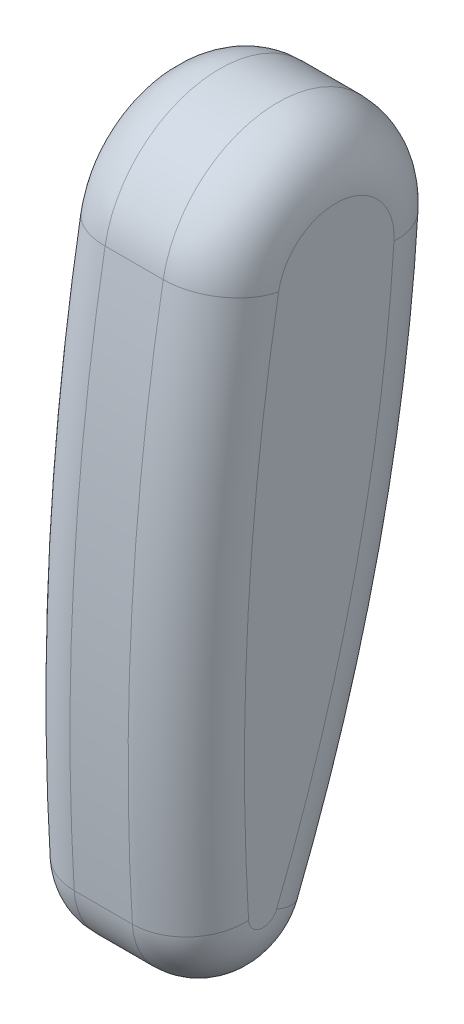
ISO-10303-21;
HEADER;
FILE_DESCRIPTION(('STEP AP214'),'2;1');
FILE_NAME('part.step','',(''),(''),'','','');
FILE_SCHEMA(('AUTOMOTIVE_DESIGN { 1 0 10303 214 1 1 1 1 }'));
ENDSEC;
DATA;
#1=APPLICATION_CONTEXT('core data for automotive mechanical design processes');
#2=APPLICATION_PROTOCOL_DEFINITION('international standard','automotive_design',2000,#1);
#3=PRODUCT_CONTEXT('',#1,'mechanical');
#4=PRODUCT('Part','Part','',(#3));
#5=PRODUCT_RELATED_PRODUCT_CATEGORY('part','',(#4));
#6=PRODUCT_DEFINITION_FORMATION('','',#4);
#7=PRODUCT_DEFINITION_CONTEXT('part definition',#1,'design');
#8=PRODUCT_DEFINITION('design','',#6,#7);
#9=PRODUCT_DEFINITION_SHAPE('','',#8);
#10=(LENGTH_UNIT() NAMED_UNIT(*) SI_UNIT(.MILLI.,.METRE.));
#11=(NAMED_UNIT(*) PLANE_ANGLE_UNIT() SI_UNIT($,.RADIAN.));
#12=(NAMED_UNIT(*) SI_UNIT($,.STERADIAN.) SOLID_ANGLE_UNIT());
#13=UNCERTAINTY_MEASURE_WITH_UNIT(LENGTH_MEASURE(1.E-05),#10,'distance_accuracy_value','');
#14=(GEOMETRIC_REPRESENTATION_CONTEXT(3) GLOBAL_UNCERTAINTY_ASSIGNED_CONTEXT((#13)) GLOBAL_UNIT_ASSIGNED_CONTEXT((#10,
#11,#12)) REPRESENTATION_CONTEXT('',''));
#15=CARTESIAN_POINT('',(0.,0.,0.));
#16=DIRECTION('',(0.,0.,1.));
#17=DIRECTION('',(1.,0.,0.));
#18=AXIS2_PLACEMENT_3D('',#15,#16,#17);
#19=CARTESIAN_POINT('',(190.5,-636.965855606091,-1940.75192617247));
#20=DIRECTION('',(-1.,0.,0.));
#21=DIRECTION('',(0.,0.,1.));
#22=AXIS2_PLACEMENT_3D('',#19,#20,#21);
#23=CYLINDRICAL_SURFACE('',#22,2032.);
#24=DIRECTION('',(-1.,0.,0.));
#25=VECTOR('',#24,1.);
#26=CARTESIAN_POINT('',(190.5,-285.382596894668,60.6009193282553));
#27=LINE('',#26,#25);
#28=CARTESIAN_POINT('',(139.7,-285.382596894668,60.6009193282553));
#29=VERTEX_POINT('',#28);
#30=CARTESIAN_POINT('',(88.9000000000001,-285.382596894668,60.6009193282553));
#31=VERTEX_POINT('',#30);
#32=EDGE_CURVE('E140',#29,#31,#27,.T.);
#33=ORIENTED_EDGE('',*,*,#32,.T.);
#34=CARTESIAN_POINT('',(88.9000000000001,-636.965855606091,-1940.75192617247));
#35=DIRECTION('',(-1.,0.,0.));
#36=DIRECTION('',(0.,0.,1.));
#37=AXIS2_PLACEMENT_3D('',#34,#35,#36);
#38=CIRCLE('',#37,2032.);
#39=CARTESIAN_POINT('',(88.9000000000001,-759.542851996072,87.547578327791));
#40=VERTEX_POINT('',#39);
#41=EDGE_CURVE('E161',#31,#40,#38,.F.);
#42=ORIENTED_EDGE('',*,*,#41,.T.);
#43=DIRECTION('',(-1.,0.,0.));
#44=VECTOR('',#43,1.);
#45=CARTESIAN_POINT('',(190.5,-759.542851996072,87.547578327791));
#46=LINE('',#45,#44);
#47=CARTESIAN_POINT('',(139.7,-759.542851996072,87.547578327791));
#48=VERTEX_POINT('',#47);
#49=EDGE_CURVE('E114',#48,#40,#46,.T.);
#50=ORIENTED_EDGE('',*,*,#49,.F.);
#51=CARTESIAN_POINT('',(139.7,-636.965855606091,-1940.75192617247));
#52=DIRECTION('',(-1.,0.,0.));
#53=DIRECTION('',(0.,0.,1.));
#54=AXIS2_PLACEMENT_3D('',#51,#52,#53);
#55=CIRCLE('',#54,2032.);
#56=EDGE_CURVE('E159',#48,#29,#55,.T.);
#57=ORIENTED_EDGE('',*,*,#56,.T.);
#58=EDGE_LOOP('',(#33,#42,#50,#57));
#59=FACE_BOUND('',#58,.T.);
#60=ADVANCED_FACE('F30',(#59),#23,.T.);
#61=CARTESIAN_POINT('',(190.5,-755.712320858886,24.1632188121575));
#62=DIRECTION('',(-1.,0.,0.));
#63=DIRECTION('',(0.,0.,1.));
#64=AXIS2_PLACEMENT_3D('',#61,#62,#63);
#65=CYLINDRICAL_SURFACE('',#64,63.5000000000002);
#66=ORIENTED_EDGE('',*,*,#49,.T.);
#67=CARTESIAN_POINT('',(88.9000000000001,-755.712320858886,24.1632188121575));
#68=DIRECTION('',(-1.,0.,0.));
#69=DIRECTION('',(0.,0.,1.));
#70=AXIS2_PLACEMENT_3D('',#67,#68,#69);
#71=CIRCLE('',#70,63.5000000000002);
#72=CARTESIAN_POINT('',(88.9000000000001,-779.308424571083,-34.7899311427283));
#73=VERTEX_POINT('',#72);
#74=EDGE_CURVE('E113',#40,#73,#71,.F.);
#75=ORIENTED_EDGE('',*,*,#74,.T.);
#76=DIRECTION('',(-1.,0.,0.));
#77=VECTOR('',#76,1.);
#78=CARTESIAN_POINT('',(190.5,-779.308424571083,-34.7899311427283));
#79=LINE('',#78,#77);
#80=CARTESIAN_POINT('',(139.7,-779.308424571083,-34.7899311427283));
#81=VERTEX_POINT('',#80);
#82=EDGE_CURVE('E96',#81,#73,#79,.T.);
#83=ORIENTED_EDGE('',*,*,#82,.F.);
#84=CARTESIAN_POINT('',(139.7,-755.712320858886,24.1632188121575));
#85=DIRECTION('',(-1.,0.,0.));
#86=DIRECTION('',(0.,0.,1.));
#87=AXIS2_PLACEMENT_3D('',#84,#85,#86);
#88=CIRCLE('',#87,63.5000000000002);
#89=EDGE_CURVE('E110',#81,#48,#88,.T.);
#90=ORIENTED_EDGE('',*,*,#89,.T.);
#91=EDGE_LOOP('',(#66,#75,#83,#90));
#92=FACE_BOUND('',#91,.T.);
#93=ADVANCED_FACE('F109',(#92),#65,.T.);
#94=CARTESIAN_POINT('',(190.5,-213.001935478344,1380.08566777453));
#95=DIRECTION('',(-1.,0.,0.));
#96=DIRECTION('',(0.,0.,1.));
#97=AXIS2_PLACEMENT_3D('',#94,#95,#96);
#98=CYLINDRICAL_SURFACE('',#97,1524.);
#99=ORIENTED_EDGE('',*,*,#82,.T.);
#100=CARTESIAN_POINT('',(88.9000000000001,-213.001935478344,1380.08566777453));
#101=DIRECTION('',(-1.,0.,0.));
#102=DIRECTION('',(0.,0.,1.));
#103=AXIS2_PLACEMENT_3D('',#100,#101,#102);
#104=CIRCLE('',#103,1524.);
#105=CARTESIAN_POINT('',(88.9000000000001,-309.38746156966,-140.863322284017));
#106=VERTEX_POINT('',#105);
#107=EDGE_CURVE('E102',#73,#106,#104,.F.);
#108=ORIENTED_EDGE('',*,*,#107,.T.);
#109=DIRECTION('',(-1.,0.,0.));
#110=VECTOR('',#109,1.);
#111=CARTESIAN_POINT('',(190.5,-309.38746156966,-140.863322284017));
#112=LINE('',#111,#110);
#113=CARTESIAN_POINT('',(139.7,-309.38746156966,-140.863322284017));
#114=VERTEX_POINT('',#113);
#115=EDGE_CURVE('E98',#114,#106,#112,.T.);
#116=ORIENTED_EDGE('',*,*,#115,.F.);
#117=CARTESIAN_POINT('',(139.7,-213.001935478344,1380.08566777453));
#118=DIRECTION('',(-1.,0.,0.));
#119=DIRECTION('',(0.,0.,1.));
#120=AXIS2_PLACEMENT_3D('',#117,#118,#119);
#121=CIRCLE('',#120,1524.);
#122=EDGE_CURVE('E93',#114,#81,#121,.T.);
#123=ORIENTED_EDGE('',*,*,#122,.T.);
#124=EDGE_LOOP('',(#99,#108,#116,#123));
#125=FACE_BOUND('',#124,.T.);
#126=ADVANCED_FACE('F95',(#125),#98,.T.);
#127=CARTESIAN_POINT('',(190.5,-302.961759830239,-39.4667229467812));
#128=DIRECTION('',(-1.,0.,0.));
#129=DIRECTION('',(0.,0.,1.));
#130=AXIS2_PLACEMENT_3D('',#127,#128,#129);
#131=CYLINDRICAL_SURFACE('',#130,101.6);
#132=ORIENTED_EDGE('',*,*,#115,.T.);
#133=CARTESIAN_POINT('',(88.9000000000001,-302.961759830239,-39.4667229467812));
#134=DIRECTION('',(-1.,0.,0.));
#135=DIRECTION('',(0.,0.,1.));
#136=AXIS2_PLACEMENT_3D('',#133,#134,#135);
#137=CIRCLE('',#136,101.6);
#138=EDGE_CURVE('E157',#106,#31,#137,.F.);
#139=ORIENTED_EDGE('',*,*,#138,.T.);
#140=ORIENTED_EDGE('',*,*,#32,.F.);
#141=CARTESIAN_POINT('',(139.7,-302.961759830239,-39.4667229467812));
#142=DIRECTION('',(-1.,0.,0.));
#143=DIRECTION('',(0.,0.,1.));
#144=AXIS2_PLACEMENT_3D('',#141,#142,#143);
#145=CIRCLE('',#144,101.6);
#146=EDGE_CURVE('E155',#29,#114,#145,.T.);
#147=ORIENTED_EDGE('',*,*,#146,.T.);
#148=EDGE_LOOP('',(#132,#139,#140,#147));
#149=FACE_BOUND('',#148,.T.);
#150=ADVANCED_FACE('F177',(#149),#131,.T.);
#151=CARTESIAN_POINT('',(190.5,-469.963807718165,-990.109324559626));
#152=DIRECTION('',(-1.,0.,0.));
#153=DIRECTION('',(0.,0.,1.));
#154=AXIS2_PLACEMENT_3D('',#151,#152,#153);
#155=PLANE('',#154);
#156=CARTESIAN_POINT('',(190.5,-213.001935478344,1380.08566777453));
#157=DIRECTION('',(-1.,0.,0.));
#158=DIRECTION('',(0.,0.,1.));
#159=AXIS2_PLACEMENT_3D('',#156,#157,#158);
#160=CIRCLE('',#159,1473.2);
#161=CARTESIAN_POINT('',(190.5,-760.431541601325,12.3725888211802));
#162=VERTEX_POINT('',#161);
#163=CARTESIAN_POINT('',(190.5,-306.174610699949,-90.1650226153994));
#164=VERTEX_POINT('',#163);
#165=EDGE_CURVE('E37',#162,#164,#160,.F.);
#166=ORIENTED_EDGE('',*,*,#165,.T.);
#167=CARTESIAN_POINT('',(190.5,-302.961759830239,-39.4667229467812));
#168=DIRECTION('',(-1.,0.,0.));
#169=DIRECTION('',(0.,0.,1.));
#170=AXIS2_PLACEMENT_3D('',#167,#168,#169);
#171=CIRCLE('',#170,50.8000000000002);
#172=CARTESIAN_POINT('',(190.5,-294.172178362453,10.5670981907374));
#173=VERTEX_POINT('',#172);
#174=EDGE_CURVE('E11',#164,#173,#171,.F.);
#175=ORIENTED_EDGE('',*,*,#174,.T.);
#176=CARTESIAN_POINT('',(190.5,-636.965855606091,-1940.75192617247));
#177=DIRECTION('',(-1.,0.,0.));
#178=DIRECTION('',(0.,0.,1.));
#179=AXIS2_PLACEMENT_3D('',#176,#177,#178);
#180=CIRCLE('',#179,1981.2);
#181=CARTESIAN_POINT('',(190.5,-756.478427086323,36.8400907152844));
#182=VERTEX_POINT('',#181);
#183=EDGE_CURVE('E163',#173,#182,#180,.F.);
#184=ORIENTED_EDGE('',*,*,#183,.T.);
#185=CARTESIAN_POINT('',(190.5,-755.712320858886,24.1632188121575));
#186=DIRECTION('',(-1.,0.,0.));
#187=DIRECTION('',(0.,0.,1.));
#188=AXIS2_PLACEMENT_3D('',#185,#186,#187);
#189=CIRCLE('',#188,12.7000000000002);
#190=EDGE_CURVE('E47',#182,#162,#189,.F.);
#191=ORIENTED_EDGE('',*,*,#190,.T.);
#192=EDGE_LOOP('',(#166,#175,#184,#191));
#193=FACE_BOUND('',#192,.T.);
#194=ADVANCED_FACE('F166',(#193),#155,.F.);
#195=CARTESIAN_POINT('',(38.1000000000001,-469.963807718165,-990.109324559626));
#196=DIRECTION('',(-1.,0.,0.));
#197=DIRECTION('',(0.,0.,1.));
#198=AXIS2_PLACEMENT_3D('',#195,#196,#197);
#199=PLANE('',#198);
#200=CARTESIAN_POINT('',(38.1000000000001,-213.001935478344,1380.08566777453));
#201=DIRECTION('',(-1.,0.,0.));
#202=DIRECTION('',(0.,0.,1.));
#203=AXIS2_PLACEMENT_3D('',#200,#201,#202);
#204=CIRCLE('',#203,1473.2);
#205=CARTESIAN_POINT('',(38.1000000000001,-306.174610699949,-90.1650226153996));
#206=VERTEX_POINT('',#205);
#207=CARTESIAN_POINT('',(38.1000000000001,-760.431541601325,12.3725888211803));
#208=VERTEX_POINT('',#207);
#209=EDGE_CURVE('E150',#206,#208,#204,.T.);
#210=ORIENTED_EDGE('',*,*,#209,.T.);
#211=CARTESIAN_POINT('',(38.1000000000001,-755.712320858886,24.1632188121575));
#212=DIRECTION('',(-1.,0.,0.));
#213=DIRECTION('',(0.,0.,1.));
#214=AXIS2_PLACEMENT_3D('',#211,#212,#213);
#215=CIRCLE('',#214,12.7000000000002);
#216=CARTESIAN_POINT('',(38.1000000000001,-756.478427086323,36.8400907152844));
#217=VERTEX_POINT('',#216);
#218=EDGE_CURVE('E103',#208,#217,#215,.T.);
#219=ORIENTED_EDGE('',*,*,#218,.T.);
#220=CARTESIAN_POINT('',(38.1000000000001,-636.965855606091,-1940.75192617247));
#221=DIRECTION('',(-1.,0.,0.));
#222=DIRECTION('',(0.,0.,1.));
#223=AXIS2_PLACEMENT_3D('',#220,#221,#222);
#224=CIRCLE('',#223,1981.2);
#225=CARTESIAN_POINT('',(38.1000000000001,-294.172178362453,10.5670981907374));
#226=VERTEX_POINT('',#225);
#227=EDGE_CURVE('E146',#217,#226,#224,.T.);
#228=ORIENTED_EDGE('',*,*,#227,.T.);
#229=CARTESIAN_POINT('',(38.1000000000001,-302.961759830239,-39.4667229467812));
#230=DIRECTION('',(-1.,0.,0.));
#231=DIRECTION('',(0.,0.,1.));
#232=AXIS2_PLACEMENT_3D('',#229,#230,#231);
#233=CIRCLE('',#232,50.8000000000002);
#234=EDGE_CURVE('E148',#226,#206,#233,.T.);
#235=ORIENTED_EDGE('',*,*,#234,.T.);
#236=EDGE_LOOP('',(#210,#219,#228,#235));
#237=FACE_BOUND('',#236,.T.);
#238=ADVANCED_FACE('F201',(#237),#199,.T.);
#239=CARTESIAN_POINT('',(88.9000000000001,-302.961759830239,-39.4667229467812));
#240=DIRECTION('',(-1.,0.,0.));
#241=DIRECTION('',(0.,0.,1.));
#242=AXIS2_PLACEMENT_3D('',#239,#240,#241);
#243=TOROIDAL_SURFACE('',#242,50.8000000000002,50.8);
#244=CARTESIAN_POINT('',(88.9000000000001,-306.174610699949,-90.1650226153996));
#245=DIRECTION('',(0.,-0.997998024972797,0.0632450958604432));
#246=DIRECTION('',(0.,-0.0632450958604432,-0.997998024972797));
#247=AXIS2_PLACEMENT_3D('',#244,#245,#246);
#248=CIRCLE('',#247,50.8);
#249=EDGE_CURVE('E134',#206,#106,#248,.T.);
#250=ORIENTED_EDGE('',*,*,#249,.F.);
#251=ORIENTED_EDGE('',*,*,#234,.F.);
#252=CARTESIAN_POINT('',(88.9000000000001,-294.172178362453,10.5670981907372));
#253=DIRECTION('',(0.,-0.984917738927523,0.173023257239874));
#254=DIRECTION('',(0.,-0.173023257239874,-0.984917738927523));
#255=AXIS2_PLACEMENT_3D('',#252,#253,#254);
#256=CIRCLE('',#255,50.8);
#257=EDGE_CURVE('E137',#31,#226,#256,.T.);
#258=ORIENTED_EDGE('',*,*,#257,.F.);
#259=ORIENTED_EDGE('',*,*,#138,.F.);
#260=EDGE_LOOP('',(#250,#251,#258,#259));
#261=FACE_BOUND('',#260,.T.);
#262=ADVANCED_FACE('F204',(#261),#243,.T.);
#263=CARTESIAN_POINT('',(88.9000000000001,-636.965855606091,-1940.75192617247));
#264=DIRECTION('',(-1.,0.,0.));
#265=DIRECTION('',(0.,0.,1.));
#266=AXIS2_PLACEMENT_3D('',#263,#264,#265);
#267=TOROIDAL_SURFACE('',#266,1981.2,50.8);
#268=ORIENTED_EDGE('',*,*,#257,.T.);
#269=ORIENTED_EDGE('',*,*,#227,.F.);
#270=CARTESIAN_POINT('',(88.9000000000001,-756.478427086323,36.8400907152844));
#271=DIRECTION('',(0.,-0.998178890009972,-0.0603233249950701));
#272=DIRECTION('',(0.,0.0603233249950701,-0.998178890009972));
#273=AXIS2_PLACEMENT_3D('',#270,#271,#272);
#274=CIRCLE('',#273,50.8);
#275=EDGE_CURVE('E127',#40,#217,#274,.T.);
#276=ORIENTED_EDGE('',*,*,#275,.F.);
#277=ORIENTED_EDGE('',*,*,#41,.F.);
#278=EDGE_LOOP('',(#268,#269,#276,#277));
#279=FACE_BOUND('',#278,.T.);
#280=ADVANCED_FACE('F208',(#279),#267,.T.);
#281=CARTESIAN_POINT('',(88.9000000000001,-213.001935478344,1380.08566777453));
#282=DIRECTION('',(-1.,0.,0.));
#283=DIRECTION('',(0.,0.,1.));
#284=AXIS2_PLACEMENT_3D('',#281,#282,#283);
#285=TOROIDAL_SURFACE('',#284,1473.2,50.8);
#286=ORIENTED_EDGE('',*,*,#249,.T.);
#287=ORIENTED_EDGE('',*,*,#107,.F.);
#288=CARTESIAN_POINT('',(88.9000000000001,-760.431541601325,12.3725888211803));
#289=DIRECTION('',(0.,-0.928396062281662,0.371592184444055));
#290=DIRECTION('',(0.,-0.371592184444055,-0.928396062281662));
#291=AXIS2_PLACEMENT_3D('',#288,#289,#290);
#292=CIRCLE('',#291,50.8);
#293=EDGE_CURVE('E125',#208,#73,#292,.T.);
#294=ORIENTED_EDGE('',*,*,#293,.F.);
#295=ORIENTED_EDGE('',*,*,#209,.F.);
#296=EDGE_LOOP('',(#286,#287,#294,#295));
#297=FACE_BOUND('',#296,.T.);
#298=ADVANCED_FACE('F212',(#297),#285,.T.);
#299=CARTESIAN_POINT('',(88.9000000000001,-755.712320858886,24.1632188121575));
#300=DIRECTION('',(-1.,0.,0.));
#301=DIRECTION('',(0.,0.,1.));
#302=AXIS2_PLACEMENT_3D('',#299,#300,#301);
#303=DEGENERATE_TOROIDAL_SURFACE('',#302,12.7000000000002,50.8,.T.);
#304=ORIENTED_EDGE('',*,*,#275,.T.);
#305=ORIENTED_EDGE('',*,*,#218,.F.);
#306=ORIENTED_EDGE('',*,*,#293,.T.);
#307=ORIENTED_EDGE('',*,*,#74,.F.);
#308=EDGE_LOOP('',(#304,#305,#306,#307));
#309=FACE_BOUND('',#308,.T.);
#310=ADVANCED_FACE('F216',(#309),#303,.T.);
#311=CARTESIAN_POINT('',(139.7,-755.712320858886,24.1632188121575));
#312=DIRECTION('',(-1.,0.,0.));
#313=DIRECTION('',(0.,0.,1.));
#314=AXIS2_PLACEMENT_3D('',#311,#312,#313);
#315=DEGENERATE_TOROIDAL_SURFACE('',#314,12.7000000000002,50.8,.T.);
#316=CARTESIAN_POINT('',(139.7,-756.478427086323,36.8400907152844));
#317=DIRECTION('',(0.,0.998178890009972,0.060323324995068));
#318=DIRECTION('',(0.,-0.060323324995068,0.998178890009972));
#319=AXIS2_PLACEMENT_3D('',#316,#317,#318);
#320=CIRCLE('',#319,50.8);
#321=EDGE_CURVE('E121',#48,#182,#320,.T.);
#322=ORIENTED_EDGE('',*,*,#321,.F.);
#323=ORIENTED_EDGE('',*,*,#89,.F.);
#324=CARTESIAN_POINT('',(139.7,-760.431541601325,12.3725888211802));
#325=DIRECTION('',(0.,0.928396062281662,-0.371592184444055));
#326=DIRECTION('',(0.,0.371592184444055,0.928396062281662));
#327=AXIS2_PLACEMENT_3D('',#324,#325,#326);
#328=CIRCLE('',#327,50.8);
#329=EDGE_CURVE('E119',#162,#81,#328,.T.);
#330=ORIENTED_EDGE('',*,*,#329,.F.);
#331=ORIENTED_EDGE('',*,*,#190,.F.);
#332=EDGE_LOOP('',(#322,#323,#330,#331));
#333=FACE_BOUND('',#332,.T.);
#334=ADVANCED_FACE('F118',(#333),#315,.T.);
#335=CARTESIAN_POINT('',(139.7,-213.001935478344,1380.08566777453));
#336=DIRECTION('',(-1.,0.,0.));
#337=DIRECTION('',(0.,0.,1.));
#338=AXIS2_PLACEMENT_3D('',#335,#336,#337);
#339=TOROIDAL_SURFACE('',#338,1473.2,50.8);
#340=ORIENTED_EDGE('',*,*,#329,.T.);
#341=ORIENTED_EDGE('',*,*,#122,.F.);
#342=CARTESIAN_POINT('',(139.7,-306.174610699949,-90.1650226153994));
#343=DIRECTION('',(0.,0.997998024972797,-0.0632450958604399));
#344=DIRECTION('',(0.,0.0632450958604399,0.997998024972797));
#345=AXIS2_PLACEMENT_3D('',#342,#343,#344);
#346=CIRCLE('',#345,50.8);
#347=EDGE_CURVE('E129',#164,#114,#346,.T.);
#348=ORIENTED_EDGE('',*,*,#347,.F.);
#349=ORIENTED_EDGE('',*,*,#165,.F.);
#350=EDGE_LOOP('',(#340,#341,#348,#349));
#351=FACE_BOUND('',#350,.T.);
#352=ADVANCED_FACE('F124',(#351),#339,.T.);
#353=CARTESIAN_POINT('',(139.7,-636.965855606091,-1940.75192617247));
#354=DIRECTION('',(-1.,0.,0.));
#355=DIRECTION('',(0.,0.,1.));
#356=AXIS2_PLACEMENT_3D('',#353,#354,#355);
#357=TOROIDAL_SURFACE('',#356,1981.2,50.8);
#358=ORIENTED_EDGE('',*,*,#321,.T.);
#359=ORIENTED_EDGE('',*,*,#183,.F.);
#360=CARTESIAN_POINT('',(139.7,-294.172178362453,10.5670981907372));
#361=DIRECTION('',(0.,0.984917738927523,-0.173023257239874));
#362=DIRECTION('',(0.,0.173023257239874,0.984917738927523));
#363=AXIS2_PLACEMENT_3D('',#360,#361,#362);
#364=CIRCLE('',#363,50.8);
#365=EDGE_CURVE('E171',#29,#173,#364,.T.);
#366=ORIENTED_EDGE('',*,*,#365,.F.);
#367=ORIENTED_EDGE('',*,*,#56,.F.);
#368=EDGE_LOOP('',(#358,#359,#366,#367));
#369=FACE_BOUND('',#368,.T.);
#370=ADVANCED_FACE('F170',(#369),#357,.T.);
#371=CARTESIAN_POINT('',(139.7,-302.961759830239,-39.4667229467812));
#372=DIRECTION('',(-1.,0.,0.));
#373=DIRECTION('',(0.,0.,1.));
#374=AXIS2_PLACEMENT_3D('',#371,#372,#373);
#375=TOROIDAL_SURFACE('',#374,50.8000000000002,50.8);
#376=ORIENTED_EDGE('',*,*,#347,.T.);
#377=ORIENTED_EDGE('',*,*,#146,.F.);
#378=ORIENTED_EDGE('',*,*,#365,.T.);
#379=ORIENTED_EDGE('',*,*,#174,.F.);
#380=EDGE_LOOP('',(#376,#377,#378,#379));
#381=FACE_BOUND('',#380,.T.);
#382=ADVANCED_FACE('F180',(#381),#375,.T.);
#383=CLOSED_SHELL('',(#60,#93,#126,#150,#194,#238,#262,#280,#298,#310,#334,#352,#370,#382));
#384=MANIFOLD_SOLID_BREP('B2',#383);
#385=ADVANCED_BREP_SHAPE_REPRESENTATION('',(#18,#384),#14);
#386=SHAPE_DEFINITION_REPRESENTATION(#9,#385);
ENDSEC;
END-ISO-10303-21;
